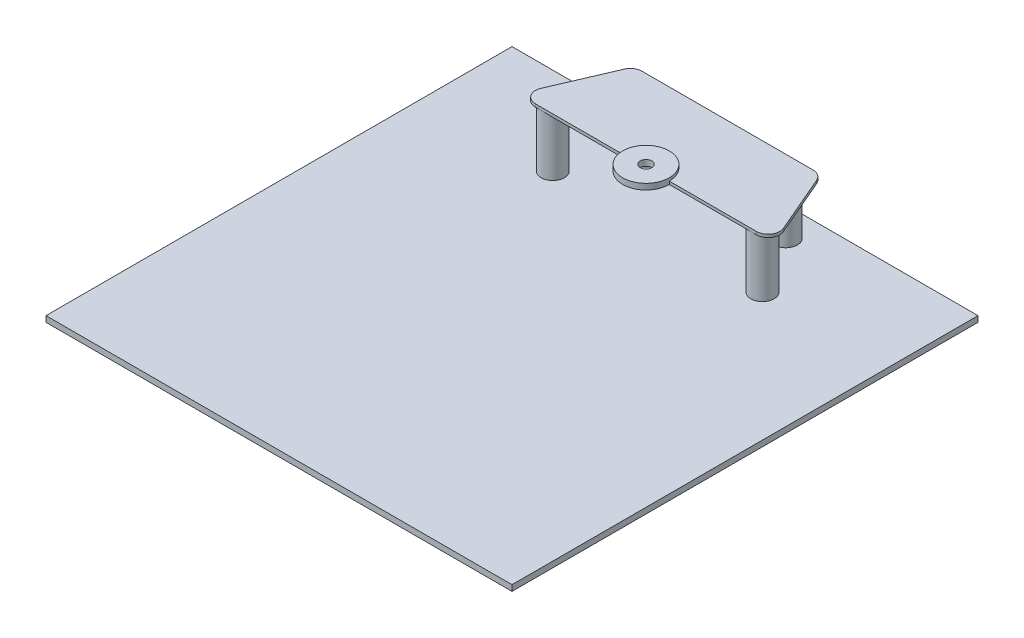
ISO-10303-21;
HEADER;
FILE_DESCRIPTION(('STEP AP214'),'2;1');
FILE_NAME('part.step','',(''),(''),'','','');
FILE_SCHEMA(('AUTOMOTIVE_DESIGN { 1 0 10303 214 1 1 1 1 }'));
ENDSEC;
DATA;
#1=APPLICATION_CONTEXT('core data for automotive mechanical design processes');
#2=APPLICATION_PROTOCOL_DEFINITION('international standard','automotive_design',2000,#1);
#3=PRODUCT_CONTEXT('',#1,'mechanical');
#4=PRODUCT('Part','Part','',(#3));
#5=PRODUCT_RELATED_PRODUCT_CATEGORY('part','',(#4));
#6=PRODUCT_DEFINITION_FORMATION('','',#4);
#7=PRODUCT_DEFINITION_CONTEXT('part definition',#1,'design');
#8=PRODUCT_DEFINITION('design','',#6,#7);
#9=PRODUCT_DEFINITION_SHAPE('','',#8);
#10=(LENGTH_UNIT() NAMED_UNIT(*) SI_UNIT(.MILLI.,.METRE.));
#11=(NAMED_UNIT(*) PLANE_ANGLE_UNIT() SI_UNIT($,.RADIAN.));
#12=(NAMED_UNIT(*) SI_UNIT($,.STERADIAN.) SOLID_ANGLE_UNIT());
#13=UNCERTAINTY_MEASURE_WITH_UNIT(LENGTH_MEASURE(1.E-05),#10,'distance_accuracy_value','');
#14=(GEOMETRIC_REPRESENTATION_CONTEXT(3) GLOBAL_UNCERTAINTY_ASSIGNED_CONTEXT((#13)) GLOBAL_UNIT_ASSIGNED_CONTEXT((#10,
#11,#12)) REPRESENTATION_CONTEXT('',''));
#15=CARTESIAN_POINT('',(0.,0.,0.));
#16=DIRECTION('',(0.,0.,1.));
#17=DIRECTION('',(1.,0.,0.));
#18=AXIS2_PLACEMENT_3D('',#15,#16,#17);
#19=CARTESIAN_POINT('',(189.669219697532,115.,-230.));
#20=DIRECTION('',(0.,0.,-1.));
#21=DIRECTION('',(-1.,0.,0.));
#22=AXIS2_PLACEMENT_3D('',#19,#20,#21);
#23=PLANE('',#22);
#24=DIRECTION('',(1.,0.,0.));
#25=VECTOR('',#24,1.);
#26=CARTESIAN_POINT('',(189.669219697532,110.,-230.));
#27=LINE('',#26,#25);
#28=CARTESIAN_POINT('',(-180.,110.,-230.));
#29=VERTEX_POINT('',#28);
#30=CARTESIAN_POINT('',(-40.,110.,-230.));
#31=VERTEX_POINT('',#30);
#32=EDGE_CURVE('E192',#29,#31,#27,.T.);
#33=ORIENTED_EDGE('',*,*,#32,.T.);
#34=DIRECTION('',(0.,1.,0.));
#35=VECTOR('',#34,1.);
#36=CARTESIAN_POINT('',(-40.,110.,-230.));
#37=LINE('',#36,#35);
#38=CARTESIAN_POINT('',(-40.,115.,-230.));
#39=VERTEX_POINT('',#38);
#40=EDGE_CURVE('E169',#31,#39,#37,.T.);
#41=ORIENTED_EDGE('',*,*,#40,.T.);
#42=DIRECTION('',(1.,0.,0.));
#43=VECTOR('',#42,1.);
#44=CARTESIAN_POINT('',(-180.,115.,-230.));
#45=LINE('',#44,#43);
#46=CARTESIAN_POINT('',(-189.669219697531,115.,-230.));
#47=VERTEX_POINT('',#46);
#48=EDGE_CURVE('E574',#47,#39,#45,.T.);
#49=ORIENTED_EDGE('',*,*,#48,.F.);
#50=DIRECTION('',(0.,-1.,0.));
#51=VECTOR('',#50,1.);
#52=CARTESIAN_POINT('',(-189.669219697531,115.,-230.));
#53=LINE('',#52,#51);
#54=CARTESIAN_POINT('',(-189.669219697531,110.,-230.));
#55=VERTEX_POINT('',#54);
#56=EDGE_CURVE('E242',#47,#55,#53,.T.);
#57=ORIENTED_EDGE('',*,*,#56,.T.);
#58=EDGE_CURVE('E195',#55,#29,#27,.T.);
#59=ORIENTED_EDGE('',*,*,#58,.T.);
#60=EDGE_LOOP('',(#33,#41,#49,#57,#59));
#61=FACE_BOUND('',#60,.T.);
#62=ADVANCED_FACE('F45',(#61),#23,.F.);
#63=CARTESIAN_POINT('',(-400.,10.,400.));
#64=DIRECTION('',(0.,0.,-1.));
#65=DIRECTION('',(-1.,0.,0.));
#66=AXIS2_PLACEMENT_3D('',#63,#64,#65);
#67=PLANE('',#66);
#68=DIRECTION('',(1.,0.,0.));
#69=VECTOR('',#68,1.);
#70=CARTESIAN_POINT('',(-400.,0.,400.));
#71=LINE('',#70,#69);
#72=CARTESIAN_POINT('',(-400.,0.,400.));
#73=VERTEX_POINT('',#72);
#74=CARTESIAN_POINT('',(400.,0.,400.));
#75=VERTEX_POINT('',#74);
#76=EDGE_CURVE('E284',#73,#75,#71,.T.);
#77=ORIENTED_EDGE('',*,*,#76,.T.);
#78=DIRECTION('',(0.,-1.,0.));
#79=VECTOR('',#78,1.);
#80=CARTESIAN_POINT('',(400.,10.,400.));
#81=LINE('',#80,#79);
#82=CARTESIAN_POINT('',(400.,10.,400.));
#83=VERTEX_POINT('',#82);
#84=EDGE_CURVE('E11',#83,#75,#81,.T.);
#85=ORIENTED_EDGE('',*,*,#84,.F.);
#86=DIRECTION('',(1.,0.,0.));
#87=VECTOR('',#86,1.);
#88=CARTESIAN_POINT('',(-400.,10.,400.));
#89=LINE('',#88,#87);
#90=CARTESIAN_POINT('',(-400.,10.,400.));
#91=VERTEX_POINT('',#90);
#92=EDGE_CURVE('E288',#91,#83,#89,.T.);
#93=ORIENTED_EDGE('',*,*,#92,.F.);
#94=DIRECTION('',(0.,-1.,0.));
#95=VECTOR('',#94,1.);
#96=CARTESIAN_POINT('',(-400.,10.,400.));
#97=LINE('',#96,#95);
#98=EDGE_CURVE('E71',#91,#73,#97,.T.);
#99=ORIENTED_EDGE('',*,*,#98,.T.);
#100=EDGE_LOOP('',(#77,#85,#93,#99));
#101=FACE_BOUND('',#100,.T.);
#102=ADVANCED_FACE('F47',(#101),#67,.F.);
#103=CARTESIAN_POINT('',(400.,10.,400.));
#104=DIRECTION('',(-1.,0.,0.));
#105=DIRECTION('',(0.,0.,1.));
#106=AXIS2_PLACEMENT_3D('',#103,#104,#105);
#107=PLANE('',#106);
#108=DIRECTION('',(0.,0.,-1.));
#109=VECTOR('',#108,1.);
#110=CARTESIAN_POINT('',(400.,0.,400.));
#111=LINE('',#110,#109);
#112=CARTESIAN_POINT('',(400.,0.,-400.));
#113=VERTEX_POINT('',#112);
#114=EDGE_CURVE('E303',#75,#113,#111,.T.);
#115=ORIENTED_EDGE('',*,*,#114,.T.);
#116=DIRECTION('',(0.,-1.,0.));
#117=VECTOR('',#116,1.);
#118=CARTESIAN_POINT('',(400.,10.,-400.));
#119=LINE('',#118,#117);
#120=CARTESIAN_POINT('',(400.,10.,-400.));
#121=VERTEX_POINT('',#120);
#122=EDGE_CURVE('E55',#121,#113,#119,.T.);
#123=ORIENTED_EDGE('',*,*,#122,.F.);
#124=DIRECTION('',(0.,0.,-1.));
#125=VECTOR('',#124,1.);
#126=CARTESIAN_POINT('',(400.,10.,400.));
#127=LINE('',#126,#125);
#128=EDGE_CURVE('E97',#83,#121,#127,.T.);
#129=ORIENTED_EDGE('',*,*,#128,.F.);
#130=ORIENTED_EDGE('',*,*,#84,.T.);
#131=EDGE_LOOP('',(#115,#123,#129,#130));
#132=FACE_BOUND('',#131,.T.);
#133=ADVANCED_FACE('F324',(#132),#107,.F.);
#134=CARTESIAN_POINT('',(-400.,10.,-400.));
#135=DIRECTION('',(0.,0.,-1.));
#136=DIRECTION('',(-1.,0.,0.));
#137=AXIS2_PLACEMENT_3D('',#134,#135,#136);
#138=PLANE('',#137);
#139=DIRECTION('',(1.,0.,0.));
#140=VECTOR('',#139,1.);
#141=CARTESIAN_POINT('',(-400.,0.,-400.));
#142=LINE('',#141,#140);
#143=CARTESIAN_POINT('',(-400.,0.,-400.));
#144=VERTEX_POINT('',#143);
#145=EDGE_CURVE('E307',#144,#113,#142,.T.);
#146=ORIENTED_EDGE('',*,*,#145,.F.);
#147=DIRECTION('',(0.,-1.,0.));
#148=VECTOR('',#147,1.);
#149=CARTESIAN_POINT('',(-400.,10.,-400.));
#150=LINE('',#149,#148);
#151=CARTESIAN_POINT('',(-400.,10.,-400.));
#152=VERTEX_POINT('',#151);
#153=EDGE_CURVE('E316',#152,#144,#150,.T.);
#154=ORIENTED_EDGE('',*,*,#153,.F.);
#155=DIRECTION('',(1.,0.,0.));
#156=VECTOR('',#155,1.);
#157=CARTESIAN_POINT('',(-400.,10.,-400.));
#158=LINE('',#157,#156);
#159=EDGE_CURVE('E294',#152,#121,#158,.T.);
#160=ORIENTED_EDGE('',*,*,#159,.T.);
#161=ORIENTED_EDGE('',*,*,#122,.T.);
#162=EDGE_LOOP('',(#146,#154,#160,#161));
#163=FACE_BOUND('',#162,.T.);
#164=ADVANCED_FACE('F322',(#163),#138,.T.);
#165=CARTESIAN_POINT('',(-400.,10.,400.));
#166=DIRECTION('',(-1.,0.,0.));
#167=DIRECTION('',(0.,0.,1.));
#168=AXIS2_PLACEMENT_3D('',#165,#166,#167);
#169=PLANE('',#168);
#170=DIRECTION('',(0.,0.,-1.));
#171=VECTOR('',#170,1.);
#172=CARTESIAN_POINT('',(-400.,0.,400.));
#173=LINE('',#172,#171);
#174=EDGE_CURVE('E291',#73,#144,#173,.T.);
#175=ORIENTED_EDGE('',*,*,#174,.F.);
#176=ORIENTED_EDGE('',*,*,#98,.F.);
#177=DIRECTION('',(0.,0.,-1.));
#178=VECTOR('',#177,1.);
#179=CARTESIAN_POINT('',(-400.,10.,400.));
#180=LINE('',#179,#178);
#181=EDGE_CURVE('E298',#91,#152,#180,.T.);
#182=ORIENTED_EDGE('',*,*,#181,.T.);
#183=ORIENTED_EDGE('',*,*,#153,.T.);
#184=EDGE_LOOP('',(#175,#176,#182,#183));
#185=FACE_BOUND('',#184,.T.);
#186=ADVANCED_FACE('F328',(#185),#169,.T.);
#187=CARTESIAN_POINT('',(0.,10.,0.));
#188=DIRECTION('',(0.,1.,0.));
#189=DIRECTION('',(0.,0.,1.));
#190=AXIS2_PLACEMENT_3D('',#187,#188,#189);
#191=PLANE('',#190);
#192=CARTESIAN_POINT('',(180.,10.,-250.));
#193=DIRECTION('',(0.,1.,0.));
#194=DIRECTION('',(0.,0.,1.));
#195=AXIS2_PLACEMENT_3D('',#192,#193,#194);
#196=CIRCLE('',#195,20.);
#197=CARTESIAN_POINT('',(180.,10.,-230.));
#198=VERTEX_POINT('',#197);
#199=EDGE_CURVE('E257',#198,#198,#196,.T.);
#200=ORIENTED_EDGE('',*,*,#199,.F.);
#201=EDGE_LOOP('',(#200));
#202=FACE_BOUND('',#201,.T.);
#203=CARTESIAN_POINT('',(-180.,10.,-250.));
#204=DIRECTION('',(0.,1.,0.));
#205=DIRECTION('',(0.,0.,1.));
#206=AXIS2_PLACEMENT_3D('',#203,#204,#205);
#207=CIRCLE('',#206,20.);
#208=CARTESIAN_POINT('',(-180.,10.,-230.));
#209=VERTEX_POINT('',#208);
#210=EDGE_CURVE('E264',#209,#209,#207,.T.);
#211=ORIENTED_EDGE('',*,*,#210,.F.);
#212=EDGE_LOOP('',(#211));
#213=FACE_BOUND('',#212,.T.);
#214=CARTESIAN_POINT('',(-120.,10.,-350.));
#215=DIRECTION('',(0.,1.,0.));
#216=DIRECTION('',(0.,0.,1.));
#217=AXIS2_PLACEMENT_3D('',#214,#215,#216);
#218=CIRCLE('',#217,20.);
#219=CARTESIAN_POINT('',(-120.,10.,-330.));
#220=VERTEX_POINT('',#219);
#221=EDGE_CURVE('E272',#220,#220,#218,.T.);
#222=ORIENTED_EDGE('',*,*,#221,.F.);
#223=EDGE_LOOP('',(#222));
#224=FACE_BOUND('',#223,.T.);
#225=CARTESIAN_POINT('',(120.,10.,-350.));
#226=DIRECTION('',(0.,1.,0.));
#227=DIRECTION('',(0.,0.,1.));
#228=AXIS2_PLACEMENT_3D('',#225,#226,#227);
#229=CIRCLE('',#228,20.);
#230=CARTESIAN_POINT('',(120.,10.,-330.));
#231=VERTEX_POINT('',#230);
#232=EDGE_CURVE('E276',#231,#231,#229,.T.);
#233=ORIENTED_EDGE('',*,*,#232,.F.);
#234=EDGE_LOOP('',(#233));
#235=FACE_BOUND('',#234,.T.);
#236=ORIENTED_EDGE('',*,*,#92,.T.);
#237=ORIENTED_EDGE('',*,*,#128,.T.);
#238=ORIENTED_EDGE('',*,*,#159,.F.);
#239=ORIENTED_EDGE('',*,*,#181,.F.);
#240=EDGE_LOOP('',(#236,#237,#238,#239));
#241=FACE_BOUND('',#240,.T.);
#242=ADVANCED_FACE('F331',(#202,#213,#224,#235,#241),#191,.T.);
#243=CARTESIAN_POINT('',(0.,0.,0.));
#244=DIRECTION('',(0.,1.,0.));
#245=DIRECTION('',(0.,0.,1.));
#246=AXIS2_PLACEMENT_3D('',#243,#244,#245);
#247=PLANE('',#246);
#248=ORIENTED_EDGE('',*,*,#76,.F.);
#249=ORIENTED_EDGE('',*,*,#174,.T.);
#250=ORIENTED_EDGE('',*,*,#145,.T.);
#251=ORIENTED_EDGE('',*,*,#114,.F.);
#252=EDGE_LOOP('',(#248,#249,#250,#251));
#253=FACE_BOUND('',#252,.T.);
#254=ADVANCED_FACE('F327',(#253),#247,.F.);
#255=CARTESIAN_POINT('',(120.,110.,-350.));
#256=DIRECTION('',(0.,-1.,0.));
#257=DIRECTION('',(0.,0.,-1.));
#258=AXIS2_PLACEMENT_3D('',#255,#256,#257);
#259=CYLINDRICAL_SURFACE('',#258,20.);
#260=CARTESIAN_POINT('',(120.,110.,-350.));
#261=DIRECTION('',(0.,1.,0.));
#262=DIRECTION('',(0.,0.,1.));
#263=AXIS2_PLACEMENT_3D('',#260,#261,#262);
#264=CIRCLE('',#263,20.);
#265=CARTESIAN_POINT('',(120.,110.,-370.));
#266=VERTEX_POINT('',#265);
#267=EDGE_CURVE('E280',#266,#266,#264,.T.);
#268=ORIENTED_EDGE('',*,*,#267,.F.);
#269=EDGE_LOOP('',(#268));
#270=FACE_BOUND('',#269,.T.);
#271=ORIENTED_EDGE('',*,*,#232,.T.);
#272=EDGE_LOOP('',(#271));
#273=FACE_BOUND('',#272,.T.);
#274=ADVANCED_FACE('F374',(#270,#273),#259,.T.);
#275=CARTESIAN_POINT('',(-120.,110.,-350.));
#276=DIRECTION('',(0.,-1.,0.));
#277=DIRECTION('',(0.,0.,-1.));
#278=AXIS2_PLACEMENT_3D('',#275,#276,#277);
#279=CYLINDRICAL_SURFACE('',#278,20.);
#280=CARTESIAN_POINT('',(-120.,110.,-350.));
#281=DIRECTION('',(0.,1.,0.));
#282=DIRECTION('',(0.,0.,1.));
#283=AXIS2_PLACEMENT_3D('',#280,#281,#282);
#284=CIRCLE('',#283,20.);
#285=CARTESIAN_POINT('',(-120.,110.,-370.));
#286=VERTEX_POINT('',#285);
#287=EDGE_CURVE('E268',#286,#286,#284,.T.);
#288=ORIENTED_EDGE('',*,*,#287,.F.);
#289=EDGE_LOOP('',(#288));
#290=FACE_BOUND('',#289,.T.);
#291=ORIENTED_EDGE('',*,*,#221,.T.);
#292=EDGE_LOOP('',(#291));
#293=FACE_BOUND('',#292,.T.);
#294=ADVANCED_FACE('F370',(#290,#293),#279,.T.);
#295=CARTESIAN_POINT('',(-180.,110.,-250.));
#296=DIRECTION('',(0.,-1.,0.));
#297=DIRECTION('',(0.,0.,-1.));
#298=AXIS2_PLACEMENT_3D('',#295,#296,#297);
#299=CYLINDRICAL_SURFACE('',#298,20.);
#300=CARTESIAN_POINT('',(-180.,110.,-250.));
#301=DIRECTION('',(0.,1.,0.));
#302=DIRECTION('',(0.,0.,1.));
#303=AXIS2_PLACEMENT_3D('',#300,#301,#302);
#304=CIRCLE('',#303,20.);
#305=EDGE_CURVE('E261',#29,#29,#304,.T.);
#306=ORIENTED_EDGE('',*,*,#305,.F.);
#307=EDGE_LOOP('',(#306));
#308=FACE_BOUND('',#307,.T.);
#309=ORIENTED_EDGE('',*,*,#210,.T.);
#310=EDGE_LOOP('',(#309));
#311=FACE_BOUND('',#310,.T.);
#312=ADVANCED_FACE('F366',(#308,#311),#299,.T.);
#313=CARTESIAN_POINT('',(180.,110.,-250.));
#314=DIRECTION('',(0.,-1.,0.));
#315=DIRECTION('',(0.,0.,-1.));
#316=AXIS2_PLACEMENT_3D('',#313,#314,#315);
#317=CYLINDRICAL_SURFACE('',#316,20.);
#318=CARTESIAN_POINT('',(180.,110.,-250.));
#319=DIRECTION('',(0.,1.,0.));
#320=DIRECTION('',(0.,0.,1.));
#321=AXIS2_PLACEMENT_3D('',#318,#319,#320);
#322=CIRCLE('',#321,20.);
#323=CARTESIAN_POINT('',(180.,110.,-230.));
#324=VERTEX_POINT('',#323);
#325=EDGE_CURVE('E190',#324,#324,#322,.T.);
#326=ORIENTED_EDGE('',*,*,#325,.F.);
#327=EDGE_LOOP('',(#326));
#328=FACE_BOUND('',#327,.T.);
#329=ORIENTED_EDGE('',*,*,#199,.T.);
#330=EDGE_LOOP('',(#329));
#331=FACE_BOUND('',#330,.T.);
#332=ADVANCED_FACE('F362',(#328,#331),#317,.T.);
#333=CARTESIAN_POINT('',(-146.812076840389,115.,-350.));
#334=DIRECTION('',(0.,-1.,0.));
#335=DIRECTION('',(0.,0.,-1.));
#336=AXIS2_PLACEMENT_3D('',#333,#334,#335);
#337=CYLINDRICAL_SURFACE('',#336,20.);
#338=CARTESIAN_POINT('',(-146.812076840389,110.,-350.));
#339=DIRECTION('',(0.,1.,0.));
#340=DIRECTION('',(0.,0.,-1.));
#341=AXIS2_PLACEMENT_3D('',#338,#339,#340);
#342=CIRCLE('',#341,20.);
#343=CARTESIAN_POINT('',(-146.812076840389,110.,-370.));
#344=VERTEX_POINT('',#343);
#345=CARTESIAN_POINT('',(-165.19497744075,110.,-357.878385971583));
#346=VERTEX_POINT('',#345);
#347=EDGE_CURVE('E561',#344,#346,#342,.T.);
#348=ORIENTED_EDGE('',*,*,#347,.T.);
#349=DIRECTION('',(0.,-1.,0.));
#350=VECTOR('',#349,1.);
#351=CARTESIAN_POINT('',(-165.19497744075,115.,-357.878385971583));
#352=LINE('',#351,#350);
#353=CARTESIAN_POINT('',(-165.19497744075,115.,-357.878385971583));
#354=VERTEX_POINT('',#353);
#355=EDGE_CURVE('E249',#354,#346,#352,.T.);
#356=ORIENTED_EDGE('',*,*,#355,.F.);
#357=CARTESIAN_POINT('',(-146.812076840389,115.,-350.));
#358=DIRECTION('',(0.,1.,0.));
#359=DIRECTION('',(0.,0.,-1.));
#360=AXIS2_PLACEMENT_3D('',#357,#358,#359);
#361=CIRCLE('',#360,20.);
#362=CARTESIAN_POINT('',(-146.812076840389,115.,-370.));
#363=VERTEX_POINT('',#362);
#364=EDGE_CURVE('E565',#363,#354,#361,.T.);
#365=ORIENTED_EDGE('',*,*,#364,.F.);
#366=DIRECTION('',(0.,-1.,0.));
#367=VECTOR('',#366,1.);
#368=CARTESIAN_POINT('',(-146.812076840389,115.,-370.));
#369=LINE('',#368,#367);
#370=EDGE_CURVE('E253',#363,#344,#369,.T.);
#371=ORIENTED_EDGE('',*,*,#370,.T.);
#372=EDGE_LOOP('',(#348,#356,#365,#371));
#373=FACE_BOUND('',#372,.T.);
#374=ADVANCED_FACE('F355',(#373),#337,.T.);
#375=CARTESIAN_POINT('',(-165.19497744075,115.,-357.878385971583));
#376=DIRECTION('',(0.919145030018058,0.,0.393919298579168));
#377=DIRECTION('',(0.393919298579168,0.,-0.919145030018058));
#378=AXIS2_PLACEMENT_3D('',#375,#376,#377);
#379=PLANE('',#378);
#380=DIRECTION('',(-0.393919298579167,0.,0.919145030018058));
#381=VECTOR('',#380,1.);
#382=CARTESIAN_POINT('',(-165.19497744075,110.,-357.878385971583));
#383=LINE('',#382,#381);
#384=CARTESIAN_POINT('',(-208.052120297893,110.,-257.878385971584));
#385=VERTEX_POINT('',#384);
#386=EDGE_CURVE('E589',#346,#385,#383,.T.);
#387=ORIENTED_EDGE('',*,*,#386,.T.);
#388=DIRECTION('',(0.,-1.,0.));
#389=VECTOR('',#388,1.);
#390=CARTESIAN_POINT('',(-208.052120297893,115.,-257.878385971584));
#391=LINE('',#390,#389);
#392=CARTESIAN_POINT('',(-208.052120297893,115.,-257.878385971584));
#393=VERTEX_POINT('',#392);
#394=EDGE_CURVE('E245',#393,#385,#391,.T.);
#395=ORIENTED_EDGE('',*,*,#394,.F.);
#396=DIRECTION('',(-0.393919298579167,0.,0.919145030018058));
#397=VECTOR('',#396,1.);
#398=CARTESIAN_POINT('',(-165.19497744075,115.,-357.878385971583));
#399=LINE('',#398,#397);
#400=EDGE_CURVE('E568',#354,#393,#399,.T.);
#401=ORIENTED_EDGE('',*,*,#400,.F.);
#402=ORIENTED_EDGE('',*,*,#355,.T.);
#403=EDGE_LOOP('',(#387,#395,#401,#402));
#404=FACE_BOUND('',#403,.T.);
#405=ADVANCED_FACE('F350',(#404),#379,.F.);
#406=CARTESIAN_POINT('',(-189.669219697532,115.,-250.));
#407=DIRECTION('',(0.,-1.,0.));
#408=DIRECTION('',(0.,0.,-1.));
#409=AXIS2_PLACEMENT_3D('',#406,#407,#408);
#410=CYLINDRICAL_SURFACE('',#409,20.);
#411=CARTESIAN_POINT('',(-189.669219697532,110.,-250.));
#412=DIRECTION('',(0.,1.,0.));
#413=DIRECTION('',(0.,0.,-1.));
#414=AXIS2_PLACEMENT_3D('',#411,#412,#413);
#415=CIRCLE('',#414,20.);
#416=EDGE_CURVE('E198',#385,#55,#415,.T.);
#417=ORIENTED_EDGE('',*,*,#416,.T.);
#418=ORIENTED_EDGE('',*,*,#56,.F.);
#419=CARTESIAN_POINT('',(-189.669219697532,115.,-250.));
#420=DIRECTION('',(0.,1.,0.));
#421=DIRECTION('',(0.,0.,-1.));
#422=AXIS2_PLACEMENT_3D('',#419,#420,#421);
#423=CIRCLE('',#422,20.);
#424=EDGE_CURVE('E571',#393,#47,#423,.T.);
#425=ORIENTED_EDGE('',*,*,#424,.F.);
#426=ORIENTED_EDGE('',*,*,#394,.T.);
#427=EDGE_LOOP('',(#417,#418,#425,#426));
#428=FACE_BOUND('',#427,.T.);
#429=ADVANCED_FACE('F344',(#428),#410,.T.);
#430=CARTESIAN_POINT('',(40.0000000000001,115.,-230.));
#431=VERTEX_POINT('',#430);
#432=CARTESIAN_POINT('',(189.669219697532,115.,-230.));
#433=VERTEX_POINT('',#432);
#434=EDGE_CURVE('E184',#431,#433,#45,.T.);
#435=ORIENTED_EDGE('',*,*,#434,.F.);
#436=DIRECTION('',(0.,1.,0.));
#437=VECTOR('',#436,1.);
#438=CARTESIAN_POINT('',(40.0000000000001,110.,-230.));
#439=LINE('',#438,#437);
#440=CARTESIAN_POINT('',(40.0000000000001,110.,-230.));
#441=VERTEX_POINT('',#440);
#442=EDGE_CURVE('E62',#431,#441,#439,.F.);
#443=ORIENTED_EDGE('',*,*,#442,.T.);
#444=EDGE_CURVE('E181',#441,#324,#27,.T.);
#445=ORIENTED_EDGE('',*,*,#444,.T.);
#446=CARTESIAN_POINT('',(189.669219697532,110.,-230.));
#447=VERTEX_POINT('',#446);
#448=EDGE_CURVE('E193',#324,#447,#27,.T.);
#449=ORIENTED_EDGE('',*,*,#448,.T.);
#450=DIRECTION('',(0.,-1.,0.));
#451=VECTOR('',#450,1.);
#452=CARTESIAN_POINT('',(189.669219697532,115.,-230.));
#453=LINE('',#452,#451);
#454=EDGE_CURVE('E239',#433,#447,#453,.T.);
#455=ORIENTED_EDGE('',*,*,#454,.F.);
#456=EDGE_LOOP('',(#435,#443,#445,#449,#455));
#457=FACE_BOUND('',#456,.T.);
#458=ADVANCED_FACE('F180',(#457),#23,.F.);
#459=CARTESIAN_POINT('',(189.669219697532,115.,-250.));
#460=DIRECTION('',(0.,-1.,0.));
#461=DIRECTION('',(0.,0.,-1.));
#462=AXIS2_PLACEMENT_3D('',#459,#460,#461);
#463=CYLINDRICAL_SURFACE('',#462,20.);
#464=CARTESIAN_POINT('',(189.669219697532,110.,-250.));
#465=DIRECTION('',(0.,1.,0.));
#466=DIRECTION('',(0.,0.,-1.));
#467=AXIS2_PLACEMENT_3D('',#464,#465,#466);
#468=CIRCLE('',#467,20.);
#469=CARTESIAN_POINT('',(208.052120297893,110.,-257.878385971584));
#470=VERTEX_POINT('',#469);
#471=EDGE_CURVE('E203',#447,#470,#468,.T.);
#472=ORIENTED_EDGE('',*,*,#471,.T.);
#473=DIRECTION('',(0.,-1.,0.));
#474=VECTOR('',#473,1.);
#475=CARTESIAN_POINT('',(208.052120297893,115.,-257.878385971584));
#476=LINE('',#475,#474);
#477=CARTESIAN_POINT('',(208.052120297893,115.,-257.878385971584));
#478=VERTEX_POINT('',#477);
#479=EDGE_CURVE('E236',#478,#470,#476,.T.);
#480=ORIENTED_EDGE('',*,*,#479,.F.);
#481=CARTESIAN_POINT('',(189.669219697532,115.,-250.));
#482=DIRECTION('',(0.,1.,0.));
#483=DIRECTION('',(0.,0.,-1.));
#484=AXIS2_PLACEMENT_3D('',#481,#482,#483);
#485=CIRCLE('',#484,20.);
#486=EDGE_CURVE('E578',#433,#478,#485,.T.);
#487=ORIENTED_EDGE('',*,*,#486,.F.);
#488=ORIENTED_EDGE('',*,*,#454,.T.);
#489=EDGE_LOOP('',(#472,#480,#487,#488));
#490=FACE_BOUND('',#489,.T.);
#491=ADVANCED_FACE('F343',(#490),#463,.T.);
#492=CARTESIAN_POINT('',(165.19497744075,115.,-357.878385971583));
#493=DIRECTION('',(-0.919145030018058,0.,0.393919298579168));
#494=DIRECTION('',(0.393919298579168,0.,0.919145030018058));
#495=AXIS2_PLACEMENT_3D('',#492,#493,#494);
#496=PLANE('',#495);
#497=DIRECTION('',(-0.393919298579168,0.,-0.919145030018058));
#498=VECTOR('',#497,1.);
#499=CARTESIAN_POINT('',(165.19497744075,110.,-357.878385971583));
#500=LINE('',#499,#498);
#501=CARTESIAN_POINT('',(165.19497744075,110.,-357.878385971583));
#502=VERTEX_POINT('',#501);
#503=EDGE_CURVE('E207',#470,#502,#500,.T.);
#504=ORIENTED_EDGE('',*,*,#503,.T.);
#505=DIRECTION('',(0.,-1.,0.));
#506=VECTOR('',#505,1.);
#507=CARTESIAN_POINT('',(165.19497744075,115.,-357.878385971583));
#508=LINE('',#507,#506);
#509=CARTESIAN_POINT('',(165.19497744075,115.,-357.878385971583));
#510=VERTEX_POINT('',#509);
#511=EDGE_CURVE('E231',#510,#502,#508,.T.);
#512=ORIENTED_EDGE('',*,*,#511,.F.);
#513=DIRECTION('',(-0.393919298579168,0.,-0.919145030018058));
#514=VECTOR('',#513,1.);
#515=CARTESIAN_POINT('',(165.19497744075,115.,-357.878385971583));
#516=LINE('',#515,#514);
#517=EDGE_CURVE('E581',#478,#510,#516,.T.);
#518=ORIENTED_EDGE('',*,*,#517,.F.);
#519=ORIENTED_EDGE('',*,*,#479,.T.);
#520=EDGE_LOOP('',(#504,#512,#518,#519));
#521=FACE_BOUND('',#520,.T.);
#522=ADVANCED_FACE('F349',(#521),#496,.F.);
#523=CARTESIAN_POINT('',(146.812076840389,115.,-350.));
#524=DIRECTION('',(0.,-1.,0.));
#525=DIRECTION('',(0.,0.,-1.));
#526=AXIS2_PLACEMENT_3D('',#523,#524,#525);
#527=CYLINDRICAL_SURFACE('',#526,20.);
#528=CARTESIAN_POINT('',(146.812076840389,110.,-350.));
#529=DIRECTION('',(0.,1.,0.));
#530=DIRECTION('',(0.,0.,-1.));
#531=AXIS2_PLACEMENT_3D('',#528,#529,#530);
#532=CIRCLE('',#531,20.);
#533=CARTESIAN_POINT('',(146.812076840389,110.,-370.));
#534=VERTEX_POINT('',#533);
#535=EDGE_CURVE('E214',#502,#534,#532,.T.);
#536=ORIENTED_EDGE('',*,*,#535,.T.);
#537=DIRECTION('',(0.,-1.,0.));
#538=VECTOR('',#537,1.);
#539=CARTESIAN_POINT('',(146.812076840389,115.,-370.));
#540=LINE('',#539,#538);
#541=CARTESIAN_POINT('',(146.812076840389,115.,-370.));
#542=VERTEX_POINT('',#541);
#543=EDGE_CURVE('E227',#542,#534,#540,.T.);
#544=ORIENTED_EDGE('',*,*,#543,.F.);
#545=CARTESIAN_POINT('',(146.812076840389,115.,-350.));
#546=DIRECTION('',(0.,1.,0.));
#547=DIRECTION('',(0.,0.,-1.));
#548=AXIS2_PLACEMENT_3D('',#545,#546,#547);
#549=CIRCLE('',#548,20.);
#550=EDGE_CURVE('E232',#510,#542,#549,.T.);
#551=ORIENTED_EDGE('',*,*,#550,.F.);
#552=ORIENTED_EDGE('',*,*,#511,.T.);
#553=EDGE_LOOP('',(#536,#544,#551,#552));
#554=FACE_BOUND('',#553,.T.);
#555=ADVANCED_FACE('F451',(#554),#527,.T.);
#556=CARTESIAN_POINT('',(-120.,115.,-370.));
#557=DIRECTION('',(0.,0.,1.));
#558=DIRECTION('',(1.,0.,0.));
#559=AXIS2_PLACEMENT_3D('',#556,#557,#558);
#560=PLANE('',#559);
#561=DIRECTION('',(-1.,0.,0.));
#562=VECTOR('',#561,1.);
#563=CARTESIAN_POINT('',(-120.,110.,-370.));
#564=LINE('',#563,#562);
#565=EDGE_CURVE('E221',#534,#266,#564,.T.);
#566=ORIENTED_EDGE('',*,*,#565,.T.);
#567=EDGE_CURVE('E226',#266,#286,#564,.T.);
#568=ORIENTED_EDGE('',*,*,#567,.T.);
#569=EDGE_CURVE('E220',#286,#344,#564,.T.);
#570=ORIENTED_EDGE('',*,*,#569,.T.);
#571=ORIENTED_EDGE('',*,*,#370,.F.);
#572=DIRECTION('',(-1.,0.,0.));
#573=VECTOR('',#572,1.);
#574=CARTESIAN_POINT('',(-120.,115.,-370.));
#575=LINE('',#574,#573);
#576=EDGE_CURVE('E225',#542,#363,#575,.T.);
#577=ORIENTED_EDGE('',*,*,#576,.F.);
#578=ORIENTED_EDGE('',*,*,#543,.T.);
#579=EDGE_LOOP('',(#566,#568,#570,#571,#577,#578));
#580=FACE_BOUND('',#579,.T.);
#581=ADVANCED_FACE('F462',(#580),#560,.F.);
#582=CARTESIAN_POINT('',(-146.812076840389,115.,-350.));
#583=DIRECTION('',(0.,-1.,0.));
#584=DIRECTION('',(0.,0.,-1.));
#585=AXIS2_PLACEMENT_3D('',#582,#583,#584);
#586=PLANE('',#585);
#587=ORIENTED_EDGE('',*,*,#48,.T.);
#588=CARTESIAN_POINT('',(0.,115.,-230.));
#589=DIRECTION('',(0.,-1.,0.));
#590=DIRECTION('',(0.,0.,-1.));
#591=AXIS2_PLACEMENT_3D('',#588,#589,#590);
#592=CIRCLE('',#591,40.);
#593=EDGE_CURVE('E175',#39,#431,#592,.T.);
#594=ORIENTED_EDGE('',*,*,#593,.T.);
#595=ORIENTED_EDGE('',*,*,#434,.T.);
#596=ORIENTED_EDGE('',*,*,#486,.T.);
#597=ORIENTED_EDGE('',*,*,#517,.T.);
#598=ORIENTED_EDGE('',*,*,#550,.T.);
#599=ORIENTED_EDGE('',*,*,#576,.T.);
#600=ORIENTED_EDGE('',*,*,#364,.T.);
#601=ORIENTED_EDGE('',*,*,#400,.T.);
#602=ORIENTED_EDGE('',*,*,#424,.T.);
#603=EDGE_LOOP('',(#587,#594,#595,#596,#597,#598,#599,#600,#601,#602));
#604=FACE_BOUND('',#603,.T.);
#605=ADVANCED_FACE('F473',(#604),#586,.F.);
#606=CARTESIAN_POINT('',(-146.812076840389,110.,-350.));
#607=DIRECTION('',(0.,-1.,0.));
#608=DIRECTION('',(0.,0.,-1.));
#609=AXIS2_PLACEMENT_3D('',#606,#607,#608);
#610=PLANE('',#609);
#611=CARTESIAN_POINT('',(0.,110.,-230.));
#612=DIRECTION('',(0.,-1.,0.));
#613=DIRECTION('',(0.,0.,-1.));
#614=AXIS2_PLACEMENT_3D('',#611,#612,#613);
#615=CIRCLE('',#614,10.);
#616=CARTESIAN_POINT('',(0.,110.,-240.));
#617=VERTEX_POINT('',#616);
#618=EDGE_CURVE('E547',#617,#617,#615,.F.);
#619=ORIENTED_EDGE('',*,*,#618,.T.);
#620=EDGE_LOOP('',(#619));
#621=FACE_BOUND('',#620,.T.);
#622=ORIENTED_EDGE('',*,*,#444,.F.);
#623=CARTESIAN_POINT('',(0.,110.,-230.));
#624=DIRECTION('',(0.,1.,0.));
#625=DIRECTION('',(0.,0.,1.));
#626=AXIS2_PLACEMENT_3D('',#623,#624,#625);
#627=CIRCLE('',#626,40.);
#628=EDGE_CURVE('E166',#31,#441,#627,.T.);
#629=ORIENTED_EDGE('',*,*,#628,.F.);
#630=ORIENTED_EDGE('',*,*,#32,.F.);
#631=ORIENTED_EDGE('',*,*,#305,.T.);
#632=ORIENTED_EDGE('',*,*,#58,.F.);
#633=ORIENTED_EDGE('',*,*,#416,.F.);
#634=ORIENTED_EDGE('',*,*,#386,.F.);
#635=ORIENTED_EDGE('',*,*,#347,.F.);
#636=ORIENTED_EDGE('',*,*,#569,.F.);
#637=ORIENTED_EDGE('',*,*,#287,.T.);
#638=ORIENTED_EDGE('',*,*,#567,.F.);
#639=ORIENTED_EDGE('',*,*,#267,.T.);
#640=ORIENTED_EDGE('',*,*,#565,.F.);
#641=ORIENTED_EDGE('',*,*,#535,.F.);
#642=ORIENTED_EDGE('',*,*,#503,.F.);
#643=ORIENTED_EDGE('',*,*,#471,.F.);
#644=ORIENTED_EDGE('',*,*,#448,.F.);
#645=ORIENTED_EDGE('',*,*,#325,.T.);
#646=EDGE_LOOP('',(#622,#629,#630,#631,#632,#633,#634,#635,#636,#637,#638,#639,#640,#641,#642,
#643,#644,#645));
#647=FACE_BOUND('',#646,.T.);
#648=ADVANCED_FACE('F188',(#621,#647),#610,.T.);
#649=CARTESIAN_POINT('',(0.,110.,-230.));
#650=DIRECTION('',(0.,1.,0.));
#651=DIRECTION('',(0.,0.,1.));
#652=AXIS2_PLACEMENT_3D('',#649,#650,#651);
#653=CYLINDRICAL_SURFACE('',#652,40.);
#654=CARTESIAN_POINT('',(0.,120.,-230.));
#655=DIRECTION('',(0.,1.,0.));
#656=DIRECTION('',(0.,0.,1.));
#657=AXIS2_PLACEMENT_3D('',#654,#655,#656);
#658=CIRCLE('',#657,40.);
#659=CARTESIAN_POINT('',(0.,120.,-190.));
#660=VERTEX_POINT('',#659);
#661=EDGE_CURVE('E176',#660,#660,#658,.T.);
#662=ORIENTED_EDGE('',*,*,#661,.F.);
#663=EDGE_LOOP('',(#662));
#664=FACE_BOUND('',#663,.T.);
#665=ORIENTED_EDGE('',*,*,#40,.F.);
#666=ORIENTED_EDGE('',*,*,#628,.T.);
#667=ORIENTED_EDGE('',*,*,#442,.F.);
#668=ORIENTED_EDGE('',*,*,#593,.F.);
#669=EDGE_LOOP('',(#665,#666,#667,#668));
#670=FACE_BOUND('',#669,.T.);
#671=ADVANCED_FACE('F167',(#664,#670),#653,.T.);
#672=CARTESIAN_POINT('',(0.,120.,-230.));
#673=DIRECTION('',(0.,1.,0.));
#674=DIRECTION('',(0.,0.,1.));
#675=AXIS2_PLACEMENT_3D('',#672,#673,#674);
#676=PLANE('',#675);
#677=CARTESIAN_POINT('',(0.,120.,-230.));
#678=DIRECTION('',(0.,1.,0.));
#679=DIRECTION('',(0.,0.,1.));
#680=AXIS2_PLACEMENT_3D('',#677,#678,#679);
#681=CIRCLE('',#680,10.);
#682=CARTESIAN_POINT('',(0.,120.,-220.));
#683=VERTEX_POINT('',#682);
#684=EDGE_CURVE('E49',#683,#683,#681,.F.);
#685=ORIENTED_EDGE('',*,*,#684,.T.);
#686=EDGE_LOOP('',(#685));
#687=FACE_BOUND('',#686,.T.);
#688=ORIENTED_EDGE('',*,*,#661,.T.);
#689=EDGE_LOOP('',(#688));
#690=FACE_BOUND('',#689,.T.);
#691=ADVANCED_FACE('F507',(#687,#690),#676,.T.);
#692=CARTESIAN_POINT('',(0.,125.,-230.));
#693=DIRECTION('',(0.,-1.,0.));
#694=DIRECTION('',(0.,0.,-1.));
#695=AXIS2_PLACEMENT_3D('',#692,#693,#694);
#696=CYLINDRICAL_SURFACE('',#695,10.);
#697=ORIENTED_EDGE('',*,*,#618,.F.);
#698=EDGE_LOOP('',(#697));
#699=FACE_BOUND('',#698,.T.);
#700=ORIENTED_EDGE('',*,*,#684,.F.);
#701=EDGE_LOOP('',(#700));
#702=FACE_BOUND('',#701,.T.);
#703=ADVANCED_FACE('F525',(#699,#702),#696,.F.);
#704=CLOSED_SHELL('',(#62,#102,#133,#164,#186,#242,#254,#274,#294,#312,#332,#374,#405,#429,#458,
#491,#522,#555,#581,#605,#648,#671,#691,#703));
#705=MANIFOLD_SOLID_BREP('B2',#704);
#706=ADVANCED_BREP_SHAPE_REPRESENTATION('',(#18,#705),#14);
#707=SHAPE_DEFINITION_REPRESENTATION(#9,#706);
ENDSEC;
END-ISO-10303-21;
